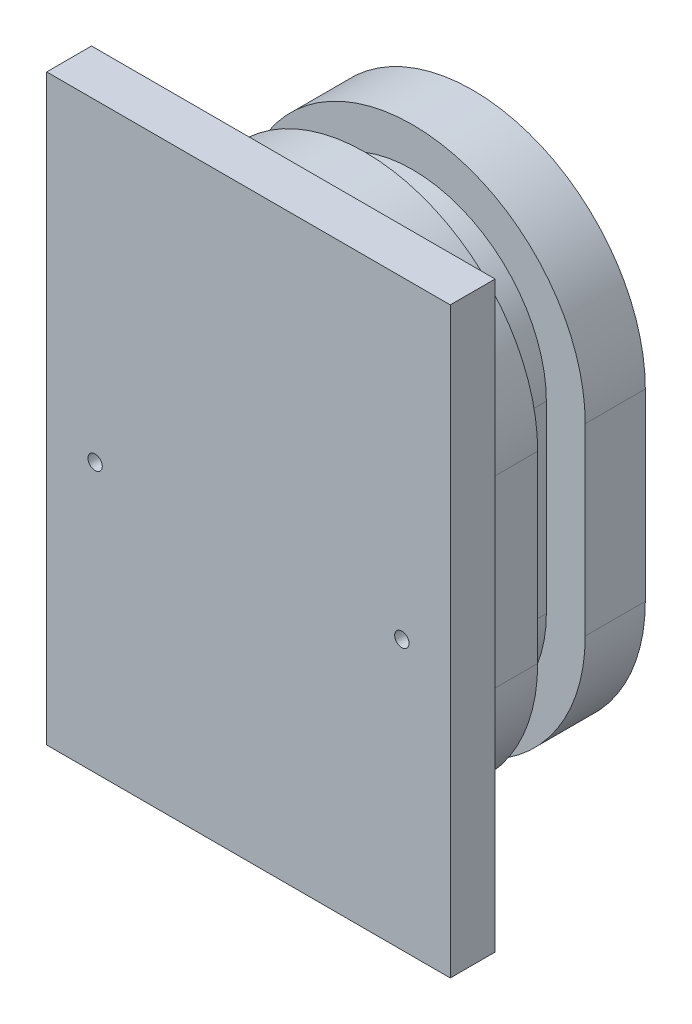
ISO-10303-21;
HEADER;
FILE_DESCRIPTION(('STEP AP214'),'2;1');
FILE_NAME('part.step','',(''),(''),'','','');
FILE_SCHEMA(('AUTOMOTIVE_DESIGN { 1 0 10303 214 1 1 1 1 }'));
ENDSEC;
DATA;
#1=APPLICATION_CONTEXT('core data for automotive mechanical design processes');
#2=APPLICATION_PROTOCOL_DEFINITION('international standard','automotive_design',2000,#1);
#3=PRODUCT_CONTEXT('',#1,'mechanical');
#4=PRODUCT('Part','Part','',(#3));
#5=PRODUCT_RELATED_PRODUCT_CATEGORY('part','',(#4));
#6=PRODUCT_DEFINITION_FORMATION('','',#4);
#7=PRODUCT_DEFINITION_CONTEXT('part definition',#1,'design');
#8=PRODUCT_DEFINITION('design','',#6,#7);
#9=PRODUCT_DEFINITION_SHAPE('','',#8);
#10=(LENGTH_UNIT() NAMED_UNIT(*) SI_UNIT(.MILLI.,.METRE.));
#11=(NAMED_UNIT(*) PLANE_ANGLE_UNIT() SI_UNIT($,.RADIAN.));
#12=(NAMED_UNIT(*) SI_UNIT($,.STERADIAN.) SOLID_ANGLE_UNIT());
#13=UNCERTAINTY_MEASURE_WITH_UNIT(LENGTH_MEASURE(1.E-05),#10,'distance_accuracy_value','');
#14=(GEOMETRIC_REPRESENTATION_CONTEXT(3) GLOBAL_UNCERTAINTY_ASSIGNED_CONTEXT((#13)) GLOBAL_UNIT_ASSIGNED_CONTEXT((#10,
#11,#12)) REPRESENTATION_CONTEXT('',''));
#15=CARTESIAN_POINT('',(0.,0.,0.));
#16=DIRECTION('',(0.,0.,1.));
#17=DIRECTION('',(1.,0.,0.));
#18=AXIS2_PLACEMENT_3D('',#15,#16,#17);
#19=CARTESIAN_POINT('',(2.88620795061788,-6.03673923854262,-20.));
#20=DIRECTION('',(0.,0.,-1.));
#21=DIRECTION('',(-1.,0.,0.));
#22=AXIS2_PLACEMENT_3D('',#19,#20,#21);
#23=PLANE('',#22);
#24=CARTESIAN_POINT('',(2.88620795061788,-6.03673923854262,-20.));
#25=DIRECTION('',(0.,0.,-1.));
#26=DIRECTION('',(-1.,0.,0.));
#27=AXIS2_PLACEMENT_3D('',#24,#25,#26);
#28=CIRCLE('',#27,19.25);
#29=CARTESIAN_POINT('',(-16.3637920493821,-6.03673923854262,-20.));
#30=VERTEX_POINT('',#29);
#31=CARTESIAN_POINT('',(22.1362079506179,-6.03673923854262,-20.));
#32=VERTEX_POINT('',#31);
#33=EDGE_CURVE('E321',#30,#32,#28,.T.);
#34=ORIENTED_EDGE('',*,*,#33,.T.);
#35=DIRECTION('',(0.,-1.,0.));
#36=VECTOR('',#35,1.);
#37=CARTESIAN_POINT('',(22.1362079506179,-6.03673923854262,-20.));
#38=LINE('',#37,#36);
#39=CARTESIAN_POINT('',(22.1362079506179,-26.5367392385426,-20.));
#40=VERTEX_POINT('',#39);
#41=EDGE_CURVE('E325',#32,#40,#38,.T.);
#42=ORIENTED_EDGE('',*,*,#41,.T.);
#43=CARTESIAN_POINT('',(2.88620795061788,-26.5367392385426,-20.));
#44=DIRECTION('',(0.,0.,-1.));
#45=DIRECTION('',(-1.,0.,0.));
#46=AXIS2_PLACEMENT_3D('',#43,#44,#45);
#47=CIRCLE('',#46,19.25);
#48=CARTESIAN_POINT('',(-16.3637920493821,-26.5367392385426,-20.));
#49=VERTEX_POINT('',#48);
#50=EDGE_CURVE('E329',#40,#49,#47,.T.);
#51=ORIENTED_EDGE('',*,*,#50,.T.);
#52=DIRECTION('',(0.,1.,0.));
#53=VECTOR('',#52,1.);
#54=CARTESIAN_POINT('',(-16.3637920493821,-6.03673923854262,-20.));
#55=LINE('',#54,#53);
#56=EDGE_CURVE('E332',#49,#30,#55,.T.);
#57=ORIENTED_EDGE('',*,*,#56,.T.);
#58=EDGE_LOOP('',(#34,#42,#51,#57));
#59=FACE_BOUND('',#58,.T.);
#60=DIRECTION('',(0.,-1.,0.));
#61=VECTOR('',#60,1.);
#62=CARTESIAN_POINT('',(13.6362079506179,-6.03673923854262,-20.));
#63=LINE('',#62,#61);
#64=CARTESIAN_POINT('',(13.6362079506179,-6.03673923854262,-20.));
#65=VERTEX_POINT('',#64);
#66=CARTESIAN_POINT('',(13.6362079506179,-26.5367392385426,-20.));
#67=VERTEX_POINT('',#66);
#68=EDGE_CURVE('E282',#65,#67,#63,.T.);
#69=ORIENTED_EDGE('',*,*,#68,.F.);
#70=CARTESIAN_POINT('',(2.88620795061788,-6.03673923854262,-20.));
#71=DIRECTION('',(0.,0.,-1.));
#72=DIRECTION('',(-1.,0.,0.));
#73=AXIS2_PLACEMENT_3D('',#70,#71,#72);
#74=CIRCLE('',#73,10.75);
#75=CARTESIAN_POINT('',(-7.86379204938211,-6.03673923854262,-20.));
#76=VERTEX_POINT('',#75);
#77=EDGE_CURVE('E279',#76,#65,#74,.T.);
#78=ORIENTED_EDGE('',*,*,#77,.F.);
#79=DIRECTION('',(0.,1.,0.));
#80=VECTOR('',#79,1.);
#81=CARTESIAN_POINT('',(-7.86379204938211,-6.03673923854262,-20.));
#82=LINE('',#81,#80);
#83=CARTESIAN_POINT('',(-7.86379204938211,-26.5367392385426,-20.));
#84=VERTEX_POINT('',#83);
#85=EDGE_CURVE('E290',#84,#76,#82,.T.);
#86=ORIENTED_EDGE('',*,*,#85,.F.);
#87=CARTESIAN_POINT('',(2.88620795061788,-26.5367392385426,-20.));
#88=DIRECTION('',(0.,0.,-1.));
#89=DIRECTION('',(-1.,0.,0.));
#90=AXIS2_PLACEMENT_3D('',#87,#88,#89);
#91=CIRCLE('',#90,10.75);
#92=EDGE_CURVE('E286',#67,#84,#91,.T.);
#93=ORIENTED_EDGE('',*,*,#92,.F.);
#94=EDGE_LOOP('',(#69,#78,#86,#93));
#95=FACE_BOUND('',#94,.T.);
#96=ADVANCED_FACE('F44',(#59,#95),#23,.T.);
#97=CARTESIAN_POINT('',(2.88620795061788,-6.03673923854262,-20.));
#98=DIRECTION('',(0.,0.,1.));
#99=DIRECTION('',(1.,0.,0.));
#100=AXIS2_PLACEMENT_3D('',#97,#98,#99);
#101=CYLINDRICAL_SURFACE('',#100,19.25);
#102=DIRECTION('',(0.,0.,1.));
#103=VECTOR('',#102,1.);
#104=CARTESIAN_POINT('',(-16.3637920493821,-6.03673923854262,-20.));
#105=LINE('',#104,#103);
#106=CARTESIAN_POINT('',(-16.3637920493821,-6.03673923854262,-13.3));
#107=VERTEX_POINT('',#106);
#108=EDGE_CURVE('E350',#30,#107,#105,.T.);
#109=ORIENTED_EDGE('',*,*,#108,.T.);
#110=CARTESIAN_POINT('',(2.88620795061788,-6.03673923854262,-13.3));
#111=DIRECTION('',(0.,0.,-1.));
#112=DIRECTION('',(-1.,0.,0.));
#113=AXIS2_PLACEMENT_3D('',#110,#111,#112);
#114=CIRCLE('',#113,19.25);
#115=CARTESIAN_POINT('',(22.1362079506179,-6.03673923854262,-13.3));
#116=VERTEX_POINT('',#115);
#117=EDGE_CURVE('E68',#107,#116,#114,.T.);
#118=ORIENTED_EDGE('',*,*,#117,.T.);
#119=DIRECTION('',(0.,0.,1.));
#120=VECTOR('',#119,1.);
#121=CARTESIAN_POINT('',(22.1362079506179,-6.03673923854262,-20.));
#122=LINE('',#121,#120);
#123=EDGE_CURVE('E365',#32,#116,#122,.T.);
#124=ORIENTED_EDGE('',*,*,#123,.F.);
#125=ORIENTED_EDGE('',*,*,#33,.F.);
#126=EDGE_LOOP('',(#109,#118,#124,#125));
#127=FACE_BOUND('',#126,.T.);
#128=ADVANCED_FACE('F436',(#127),#101,.T.);
#129=CARTESIAN_POINT('',(22.1362079506179,-6.03673923854262,-20.));
#130=DIRECTION('',(-1.,0.,0.));
#131=DIRECTION('',(0.,0.,1.));
#132=AXIS2_PLACEMENT_3D('',#129,#130,#131);
#133=PLANE('',#132);
#134=ORIENTED_EDGE('',*,*,#123,.T.);
#135=DIRECTION('',(0.,-1.,0.));
#136=VECTOR('',#135,1.);
#137=CARTESIAN_POINT('',(22.1362079506179,-6.03673923854262,-13.3));
#138=LINE('',#137,#136);
#139=CARTESIAN_POINT('',(22.1362079506179,-26.5367392385426,-13.3));
#140=VERTEX_POINT('',#139);
#141=EDGE_CURVE('E257',#116,#140,#138,.T.);
#142=ORIENTED_EDGE('',*,*,#141,.T.);
#143=DIRECTION('',(0.,0.,1.));
#144=VECTOR('',#143,1.);
#145=CARTESIAN_POINT('',(22.1362079506179,-26.5367392385426,-20.));
#146=LINE('',#145,#144);
#147=EDGE_CURVE('E360',#40,#140,#146,.T.);
#148=ORIENTED_EDGE('',*,*,#147,.F.);
#149=ORIENTED_EDGE('',*,*,#41,.F.);
#150=EDGE_LOOP('',(#134,#142,#148,#149));
#151=FACE_BOUND('',#150,.T.);
#152=ADVANCED_FACE('F442',(#151),#133,.F.);
#153=CARTESIAN_POINT('',(2.88620795061788,-26.5367392385426,-20.));
#154=DIRECTION('',(0.,0.,1.));
#155=DIRECTION('',(1.,0.,0.));
#156=AXIS2_PLACEMENT_3D('',#153,#154,#155);
#157=CYLINDRICAL_SURFACE('',#156,19.25);
#158=ORIENTED_EDGE('',*,*,#147,.T.);
#159=CARTESIAN_POINT('',(2.88620795061788,-26.5367392385426,-13.3));
#160=DIRECTION('',(0.,0.,-1.));
#161=DIRECTION('',(-1.,0.,0.));
#162=AXIS2_PLACEMENT_3D('',#159,#160,#161);
#163=CIRCLE('',#162,19.25);
#164=CARTESIAN_POINT('',(-16.3637920493821,-26.5367392385426,-13.3));
#165=VERTEX_POINT('',#164);
#166=EDGE_CURVE('E262',#140,#165,#163,.T.);
#167=ORIENTED_EDGE('',*,*,#166,.T.);
#168=DIRECTION('',(0.,0.,1.));
#169=VECTOR('',#168,1.);
#170=CARTESIAN_POINT('',(-16.3637920493821,-26.5367392385426,-20.));
#171=LINE('',#170,#169);
#172=EDGE_CURVE('E355',#49,#165,#171,.T.);
#173=ORIENTED_EDGE('',*,*,#172,.F.);
#174=ORIENTED_EDGE('',*,*,#50,.F.);
#175=EDGE_LOOP('',(#158,#167,#173,#174));
#176=FACE_BOUND('',#175,.T.);
#177=ADVANCED_FACE('F454',(#176),#157,.T.);
#178=CARTESIAN_POINT('',(-16.3637920493821,-6.03673923854262,-20.));
#179=DIRECTION('',(1.,0.,0.));
#180=DIRECTION('',(0.,0.,-1.));
#181=AXIS2_PLACEMENT_3D('',#178,#179,#180);
#182=PLANE('',#181);
#183=ORIENTED_EDGE('',*,*,#172,.T.);
#184=DIRECTION('',(0.,1.,0.));
#185=VECTOR('',#184,1.);
#186=CARTESIAN_POINT('',(-16.3637920493821,-6.03673923854262,-13.3));
#187=LINE('',#186,#185);
#188=EDGE_CURVE('E266',#165,#107,#187,.T.);
#189=ORIENTED_EDGE('',*,*,#188,.T.);
#190=ORIENTED_EDGE('',*,*,#108,.F.);
#191=ORIENTED_EDGE('',*,*,#56,.F.);
#192=EDGE_LOOP('',(#183,#189,#190,#191));
#193=FACE_BOUND('',#192,.T.);
#194=ADVANCED_FACE('F451',(#193),#182,.F.);
#195=CARTESIAN_POINT('',(2.88620795061788,-6.03673923854262,-20.));
#196=DIRECTION('',(0.,0.,1.));
#197=DIRECTION('',(1.,0.,0.));
#198=AXIS2_PLACEMENT_3D('',#195,#196,#197);
#199=CYLINDRICAL_SURFACE('',#198,10.75);
#200=CARTESIAN_POINT('',(2.88620795061788,-6.03673923854262,0.));
#201=DIRECTION('',(0.,0.,-1.));
#202=DIRECTION('',(-1.,0.,0.));
#203=AXIS2_PLACEMENT_3D('',#200,#201,#202);
#204=CIRCLE('',#203,10.75);
#205=CARTESIAN_POINT('',(-7.86379204938211,-6.03673923854262,0.));
#206=VERTEX_POINT('',#205);
#207=CARTESIAN_POINT('',(13.6362079506179,-6.03673923854262,0.));
#208=VERTEX_POINT('',#207);
#209=EDGE_CURVE('E269',#206,#208,#204,.T.);
#210=ORIENTED_EDGE('',*,*,#209,.F.);
#211=DIRECTION('',(0.,0.,1.));
#212=VECTOR('',#211,1.);
#213=CARTESIAN_POINT('',(-7.86379204938211,-6.03673923854262,-20.));
#214=LINE('',#213,#212);
#215=EDGE_CURVE('E293',#76,#206,#214,.T.);
#216=ORIENTED_EDGE('',*,*,#215,.F.);
#217=ORIENTED_EDGE('',*,*,#77,.T.);
#218=DIRECTION('',(0.,0.,1.));
#219=VECTOR('',#218,1.);
#220=CARTESIAN_POINT('',(13.6362079506179,-6.03673923854262,-20.));
#221=LINE('',#220,#219);
#222=EDGE_CURVE('E316',#65,#208,#221,.T.);
#223=ORIENTED_EDGE('',*,*,#222,.T.);
#224=EDGE_LOOP('',(#210,#216,#217,#223));
#225=FACE_BOUND('',#224,.T.);
#226=ADVANCED_FACE('F449',(#225),#199,.F.);
#227=CARTESIAN_POINT('',(13.6362079506179,-6.03673923854262,-20.));
#228=DIRECTION('',(-1.,0.,0.));
#229=DIRECTION('',(0.,-1.,0.));
#230=AXIS2_PLACEMENT_3D('',#227,#228,#229);
#231=PLANE('',#230);
#232=DIRECTION('',(0.,-1.,0.));
#233=VECTOR('',#232,1.);
#234=CARTESIAN_POINT('',(13.6362079506179,-6.03673923854262,0.));
#235=LINE('',#234,#233);
#236=CARTESIAN_POINT('',(13.6362079506179,-26.5367392385426,0.));
#237=VERTEX_POINT('',#236);
#238=EDGE_CURVE('E297',#208,#237,#235,.T.);
#239=ORIENTED_EDGE('',*,*,#238,.F.);
#240=ORIENTED_EDGE('',*,*,#222,.F.);
#241=ORIENTED_EDGE('',*,*,#68,.T.);
#242=DIRECTION('',(0.,0.,1.));
#243=VECTOR('',#242,1.);
#244=CARTESIAN_POINT('',(13.6362079506179,-26.5367392385426,-20.));
#245=LINE('',#244,#243);
#246=EDGE_CURVE('E313',#67,#237,#245,.T.);
#247=ORIENTED_EDGE('',*,*,#246,.T.);
#248=EDGE_LOOP('',(#239,#240,#241,#247));
#249=FACE_BOUND('',#248,.T.);
#250=ADVANCED_FACE('F540',(#249),#231,.T.);
#251=CARTESIAN_POINT('',(2.88620795061788,-26.5367392385426,-20.));
#252=DIRECTION('',(0.,0.,1.));
#253=DIRECTION('',(1.,0.,0.));
#254=AXIS2_PLACEMENT_3D('',#251,#252,#253);
#255=CYLINDRICAL_SURFACE('',#254,10.75);
#256=CARTESIAN_POINT('',(2.88620795061788,-26.5367392385426,0.));
#257=DIRECTION('',(0.,0.,-1.));
#258=DIRECTION('',(-1.,0.,0.));
#259=AXIS2_PLACEMENT_3D('',#256,#257,#258);
#260=CIRCLE('',#259,10.75);
#261=CARTESIAN_POINT('',(-7.86379204938211,-26.5367392385426,0.));
#262=VERTEX_POINT('',#261);
#263=EDGE_CURVE('E301',#237,#262,#260,.T.);
#264=ORIENTED_EDGE('',*,*,#263,.F.);
#265=ORIENTED_EDGE('',*,*,#246,.F.);
#266=ORIENTED_EDGE('',*,*,#92,.T.);
#267=DIRECTION('',(0.,0.,1.));
#268=VECTOR('',#267,1.);
#269=CARTESIAN_POINT('',(-7.86379204938211,-26.5367392385426,-20.));
#270=LINE('',#269,#268);
#271=EDGE_CURVE('E310',#84,#262,#270,.T.);
#272=ORIENTED_EDGE('',*,*,#271,.T.);
#273=EDGE_LOOP('',(#264,#265,#266,#272));
#274=FACE_BOUND('',#273,.T.);
#275=ADVANCED_FACE('F537',(#274),#255,.F.);
#276=CARTESIAN_POINT('',(-7.86379204938211,-6.03673923854262,-20.));
#277=DIRECTION('',(1.,0.,0.));
#278=DIRECTION('',(0.,1.,0.));
#279=AXIS2_PLACEMENT_3D('',#276,#277,#278);
#280=PLANE('',#279);
#281=DIRECTION('',(0.,1.,0.));
#282=VECTOR('',#281,1.);
#283=CARTESIAN_POINT('',(-7.86379204938211,-6.03673923854262,0.));
#284=LINE('',#283,#282);
#285=EDGE_CURVE('E283',#262,#206,#284,.T.);
#286=ORIENTED_EDGE('',*,*,#285,.F.);
#287=ORIENTED_EDGE('',*,*,#271,.F.);
#288=ORIENTED_EDGE('',*,*,#85,.T.);
#289=ORIENTED_EDGE('',*,*,#215,.T.);
#290=EDGE_LOOP('',(#286,#287,#288,#289));
#291=FACE_BOUND('',#290,.T.);
#292=ADVANCED_FACE('F469',(#291),#280,.T.);
#293=CARTESIAN_POINT('',(0.,0.,0.));
#294=DIRECTION('',(0.,0.,1.));
#295=DIRECTION('',(1.,0.,0.));
#296=AXIS2_PLACEMENT_3D('',#293,#294,#295);
#297=PLANE('',#296);
#298=ORIENTED_EDGE('',*,*,#285,.T.);
#299=ORIENTED_EDGE('',*,*,#209,.T.);
#300=ORIENTED_EDGE('',*,*,#238,.T.);
#301=ORIENTED_EDGE('',*,*,#263,.T.);
#302=EDGE_LOOP('',(#298,#299,#300,#301));
#303=FACE_BOUND('',#302,.T.);
#304=ADVANCED_FACE('F465',(#303),#297,.F.);
#305=CARTESIAN_POINT('',(2.88620795061788,-6.03673923854262,-13.3));
#306=DIRECTION('',(0.,0.,-1.));
#307=DIRECTION('',(-1.,0.,0.));
#308=AXIS2_PLACEMENT_3D('',#305,#306,#307);
#309=PLANE('',#308);
#310=ORIENTED_EDGE('',*,*,#117,.F.);
#311=ORIENTED_EDGE('',*,*,#188,.F.);
#312=ORIENTED_EDGE('',*,*,#166,.F.);
#313=ORIENTED_EDGE('',*,*,#141,.F.);
#314=EDGE_LOOP('',(#310,#311,#312,#313));
#315=FACE_BOUND('',#314,.T.);
#316=DIRECTION('',(0.,-1.,0.));
#317=VECTOR('',#316,1.);
#318=CARTESIAN_POINT('',(17.8022079506179,-6.03673923854262,-13.3));
#319=LINE('',#318,#317);
#320=CARTESIAN_POINT('',(17.8022079506179,-6.03673923854262,-13.3));
#321=VERTEX_POINT('',#320);
#322=CARTESIAN_POINT('',(17.8022079506179,-26.5367392385426,-13.3));
#323=VERTEX_POINT('',#322);
#324=EDGE_CURVE('E215',#321,#323,#319,.T.);
#325=ORIENTED_EDGE('',*,*,#324,.T.);
#326=CARTESIAN_POINT('',(2.88620795061788,-26.5367392385426,-13.3));
#327=DIRECTION('',(0.,0.,-1.));
#328=DIRECTION('',(-1.,0.,0.));
#329=AXIS2_PLACEMENT_3D('',#326,#327,#328);
#330=CIRCLE('',#329,14.916);
#331=CARTESIAN_POINT('',(-12.0297920493821,-26.5367392385426,-13.3));
#332=VERTEX_POINT('',#331);
#333=EDGE_CURVE('E219',#323,#332,#330,.T.);
#334=ORIENTED_EDGE('',*,*,#333,.T.);
#335=DIRECTION('',(0.,1.,0.));
#336=VECTOR('',#335,1.);
#337=CARTESIAN_POINT('',(-12.0297920493821,-6.03673923854262,-13.3));
#338=LINE('',#337,#336);
#339=CARTESIAN_POINT('',(-12.0297920493821,-6.03673923854262,-13.3));
#340=VERTEX_POINT('',#339);
#341=EDGE_CURVE('E223',#332,#340,#338,.T.);
#342=ORIENTED_EDGE('',*,*,#341,.T.);
#343=CARTESIAN_POINT('',(2.88620795061788,-6.03673923854262,-13.3));
#344=DIRECTION('',(0.,0.,-1.));
#345=DIRECTION('',(-1.,0.,0.));
#346=AXIS2_PLACEMENT_3D('',#343,#344,#345);
#347=CIRCLE('',#346,14.916);
#348=EDGE_CURVE('E212',#340,#321,#347,.T.);
#349=ORIENTED_EDGE('',*,*,#348,.T.);
#350=EDGE_LOOP('',(#325,#334,#342,#349));
#351=FACE_BOUND('',#350,.T.);
#352=ADVANCED_FACE('F468',(#315,#351),#309,.F.);
#353=CARTESIAN_POINT('',(2.88620795061788,-6.03673923854262,-8.));
#354=DIRECTION('',(0.,0.,-1.));
#355=DIRECTION('',(-1.,0.,0.));
#356=AXIS2_PLACEMENT_3D('',#353,#354,#355);
#357=PLANE('',#356);
#358=CARTESIAN_POINT('',(2.88620795061788,-6.03673923854262,-8.));
#359=DIRECTION('',(0.,0.,-1.));
#360=DIRECTION('',(-1.,0.,0.));
#361=AXIS2_PLACEMENT_3D('',#358,#359,#360);
#362=CIRCLE('',#361,19.25);
#363=CARTESIAN_POINT('',(-16.3637920493821,-6.03673923854262,-8.));
#364=VERTEX_POINT('',#363);
#365=CARTESIAN_POINT('',(22.1362079506179,-6.03673923854262,-8.));
#366=VERTEX_POINT('',#365);
#367=EDGE_CURVE('E254',#364,#366,#362,.T.);
#368=ORIENTED_EDGE('',*,*,#367,.T.);
#369=DIRECTION('',(0.,-1.,0.));
#370=VECTOR('',#369,1.);
#371=CARTESIAN_POINT('',(22.1362079506179,-6.03673923854262,-8.));
#372=LINE('',#371,#370);
#373=CARTESIAN_POINT('',(22.1362079506179,-26.5367392385426,-8.));
#374=VERTEX_POINT('',#373);
#375=EDGE_CURVE('E272',#366,#374,#372,.T.);
#376=ORIENTED_EDGE('',*,*,#375,.T.);
#377=CARTESIAN_POINT('',(2.88620795061788,-26.5367392385426,-8.));
#378=DIRECTION('',(0.,0.,-1.));
#379=DIRECTION('',(-1.,0.,0.));
#380=AXIS2_PLACEMENT_3D('',#377,#378,#379);
#381=CIRCLE('',#380,19.25);
#382=CARTESIAN_POINT('',(-16.3637920493821,-26.5367392385426,-8.));
#383=VERTEX_POINT('',#382);
#384=EDGE_CURVE('E60',#374,#383,#381,.T.);
#385=ORIENTED_EDGE('',*,*,#384,.T.);
#386=DIRECTION('',(0.,1.,0.));
#387=VECTOR('',#386,1.);
#388=CARTESIAN_POINT('',(-16.3637920493821,-6.03673923854262,-8.));
#389=LINE('',#388,#387);
#390=EDGE_CURVE('E258',#383,#364,#389,.T.);
#391=ORIENTED_EDGE('',*,*,#390,.T.);
#392=EDGE_LOOP('',(#368,#376,#385,#391));
#393=FACE_BOUND('',#392,.T.);
#394=CARTESIAN_POINT('',(2.88620795061788,-6.03673923854262,-8.));
#395=DIRECTION('',(0.,0.,-1.));
#396=DIRECTION('',(-1.,0.,0.));
#397=AXIS2_PLACEMENT_3D('',#394,#395,#396);
#398=CIRCLE('',#397,14.916);
#399=CARTESIAN_POINT('',(-12.0297920493821,-6.03673923854262,-8.));
#400=VERTEX_POINT('',#399);
#401=CARTESIAN_POINT('',(17.8022079506179,-6.03673923854262,-8.));
#402=VERTEX_POINT('',#401);
#403=EDGE_CURVE('E211',#400,#402,#398,.T.);
#404=ORIENTED_EDGE('',*,*,#403,.F.);
#405=DIRECTION('',(0.,1.,0.));
#406=VECTOR('',#405,1.);
#407=CARTESIAN_POINT('',(-12.0297920493821,-6.03673923854262,-8.));
#408=LINE('',#407,#406);
#409=CARTESIAN_POINT('',(-12.0297920493821,-26.5367392385426,-8.));
#410=VERTEX_POINT('',#409);
#411=EDGE_CURVE('E216',#410,#400,#408,.T.);
#412=ORIENTED_EDGE('',*,*,#411,.F.);
#413=CARTESIAN_POINT('',(2.88620795061788,-26.5367392385426,-8.));
#414=DIRECTION('',(0.,0.,-1.));
#415=DIRECTION('',(-1.,0.,0.));
#416=AXIS2_PLACEMENT_3D('',#413,#414,#415);
#417=CIRCLE('',#416,14.916);
#418=CARTESIAN_POINT('',(17.8022079506179,-26.5367392385426,-8.));
#419=VERTEX_POINT('',#418);
#420=EDGE_CURVE('E234',#419,#410,#417,.T.);
#421=ORIENTED_EDGE('',*,*,#420,.F.);
#422=DIRECTION('',(0.,-1.,0.));
#423=VECTOR('',#422,1.);
#424=CARTESIAN_POINT('',(17.8022079506179,-6.03673923854262,-8.));
#425=LINE('',#424,#423);
#426=EDGE_CURVE('E230',#402,#419,#425,.T.);
#427=ORIENTED_EDGE('',*,*,#426,.F.);
#428=EDGE_LOOP('',(#404,#412,#421,#427));
#429=FACE_BOUND('',#428,.T.);
#430=ADVANCED_FACE('F502',(#393,#429),#357,.T.);
#431=CARTESIAN_POINT('',(2.88620795061788,-6.03673923854262,-13.3));
#432=DIRECTION('',(0.,0.,1.));
#433=DIRECTION('',(1.,0.,0.));
#434=AXIS2_PLACEMENT_3D('',#431,#432,#433);
#435=CYLINDRICAL_SURFACE('',#434,14.916);
#436=ORIENTED_EDGE('',*,*,#403,.T.);
#437=DIRECTION('',(0.,0.,1.));
#438=VECTOR('',#437,1.);
#439=CARTESIAN_POINT('',(17.8022079506179,-6.03673923854262,-13.3));
#440=LINE('',#439,#438);
#441=EDGE_CURVE('E250',#321,#402,#440,.T.);
#442=ORIENTED_EDGE('',*,*,#441,.F.);
#443=ORIENTED_EDGE('',*,*,#348,.F.);
#444=DIRECTION('',(0.,0.,1.));
#445=VECTOR('',#444,1.);
#446=CARTESIAN_POINT('',(-12.0297920493821,-6.03673923854262,-13.3));
#447=LINE('',#446,#445);
#448=EDGE_CURVE('E226',#340,#400,#447,.T.);
#449=ORIENTED_EDGE('',*,*,#448,.T.);
#450=EDGE_LOOP('',(#436,#442,#443,#449));
#451=FACE_BOUND('',#450,.T.);
#452=ADVANCED_FACE('F505',(#451),#435,.T.);
#453=CARTESIAN_POINT('',(17.8022079506179,-6.03673923854262,-13.3));
#454=DIRECTION('',(-1.,0.,0.));
#455=DIRECTION('',(0.,0.,1.));
#456=AXIS2_PLACEMENT_3D('',#453,#454,#455);
#457=PLANE('',#456);
#458=ORIENTED_EDGE('',*,*,#426,.T.);
#459=DIRECTION('',(0.,0.,1.));
#460=VECTOR('',#459,1.);
#461=CARTESIAN_POINT('',(17.8022079506179,-26.5367392385426,-13.3));
#462=LINE('',#461,#460);
#463=EDGE_CURVE('E247',#323,#419,#462,.T.);
#464=ORIENTED_EDGE('',*,*,#463,.F.);
#465=ORIENTED_EDGE('',*,*,#324,.F.);
#466=ORIENTED_EDGE('',*,*,#441,.T.);
#467=EDGE_LOOP('',(#458,#464,#465,#466));
#468=FACE_BOUND('',#467,.T.);
#469=ADVANCED_FACE('F522',(#468),#457,.F.);
#470=CARTESIAN_POINT('',(2.88620795061788,-26.5367392385426,-13.3));
#471=DIRECTION('',(0.,0.,1.));
#472=DIRECTION('',(1.,0.,0.));
#473=AXIS2_PLACEMENT_3D('',#470,#471,#472);
#474=CYLINDRICAL_SURFACE('',#473,14.916);
#475=ORIENTED_EDGE('',*,*,#420,.T.);
#476=DIRECTION('',(0.,0.,1.));
#477=VECTOR('',#476,1.);
#478=CARTESIAN_POINT('',(-12.0297920493821,-26.5367392385426,-13.3));
#479=LINE('',#478,#477);
#480=EDGE_CURVE('E244',#332,#410,#479,.T.);
#481=ORIENTED_EDGE('',*,*,#480,.F.);
#482=ORIENTED_EDGE('',*,*,#333,.F.);
#483=ORIENTED_EDGE('',*,*,#463,.T.);
#484=EDGE_LOOP('',(#475,#481,#482,#483));
#485=FACE_BOUND('',#484,.T.);
#486=ADVANCED_FACE('F517',(#485),#474,.T.);
#487=CARTESIAN_POINT('',(-12.0297920493821,-6.03673923854262,-13.3));
#488=DIRECTION('',(1.,0.,0.));
#489=DIRECTION('',(0.,1.,0.));
#490=AXIS2_PLACEMENT_3D('',#487,#488,#489);
#491=PLANE('',#490);
#492=ORIENTED_EDGE('',*,*,#411,.T.);
#493=ORIENTED_EDGE('',*,*,#448,.F.);
#494=ORIENTED_EDGE('',*,*,#341,.F.);
#495=ORIENTED_EDGE('',*,*,#480,.T.);
#496=EDGE_LOOP('',(#492,#493,#494,#495));
#497=FACE_BOUND('',#496,.T.);
#498=ADVANCED_FACE('F432',(#497),#491,.F.);
#499=CARTESIAN_POINT('',(0.,0.,5.));
#500=DIRECTION('',(0.,0.,1.));
#501=DIRECTION('',(1.,0.,0.));
#502=AXIS2_PLACEMENT_3D('',#499,#500,#501);
#503=PLANE('',#502);
#504=CARTESIAN_POINT('',(-14.2137920493821,-18.7867392385426,5.));
#505=DIRECTION('',(0.,0.,1.));
#506=DIRECTION('',(1.,0.,0.));
#507=AXIS2_PLACEMENT_3D('',#504,#505,#506);
#508=CIRCLE('',#507,0.79999999999999);
#509=CARTESIAN_POINT('',(-13.4137920493821,-18.7867392385426,5.));
#510=VERTEX_POINT('',#509);
#511=EDGE_CURVE('E198',#510,#510,#508,.T.);
#512=ORIENTED_EDGE('',*,*,#511,.F.);
#513=EDGE_LOOP('',(#512));
#514=FACE_BOUND('',#513,.T.);
#515=CARTESIAN_POINT('',(19.9862079506179,-18.7867392385426,5.));
#516=DIRECTION('',(0.,0.,1.));
#517=DIRECTION('',(1.,0.,0.));
#518=AXIS2_PLACEMENT_3D('',#515,#516,#517);
#519=CIRCLE('',#518,0.799999999999988);
#520=CARTESIAN_POINT('',(20.7862079506179,-18.7867392385426,5.));
#521=VERTEX_POINT('',#520);
#522=EDGE_CURVE('E197',#521,#521,#519,.T.);
#523=ORIENTED_EDGE('',*,*,#522,.F.);
#524=EDGE_LOOP('',(#523));
#525=FACE_BOUND('',#524,.T.);
#526=DIRECTION('',(0.,-1.,0.));
#527=VECTOR('',#526,1.);
#528=CARTESIAN_POINT('',(-19.6137920493821,16.2132607614574,5.));
#529=LINE('',#528,#527);
#530=CARTESIAN_POINT('',(-19.6137920493821,16.2132607614574,5.));
#531=VERTEX_POINT('',#530);
#532=CARTESIAN_POINT('',(-19.6137920493821,-48.7867392385426,5.));
#533=VERTEX_POINT('',#532);
#534=EDGE_CURVE('E370',#531,#533,#529,.T.);
#535=ORIENTED_EDGE('',*,*,#534,.T.);
#536=DIRECTION('',(1.,0.,0.));
#537=VECTOR('',#536,1.);
#538=CARTESIAN_POINT('',(-19.6137920493821,-48.7867392385426,5.));
#539=LINE('',#538,#537);
#540=CARTESIAN_POINT('',(25.3862079506179,-48.7867392385426,5.));
#541=VERTEX_POINT('',#540);
#542=EDGE_CURVE('E374',#533,#541,#539,.T.);
#543=ORIENTED_EDGE('',*,*,#542,.T.);
#544=DIRECTION('',(0.,1.,0.));
#545=VECTOR('',#544,1.);
#546=CARTESIAN_POINT('',(25.3862079506179,16.2132607614574,5.));
#547=LINE('',#546,#545);
#548=CARTESIAN_POINT('',(25.3862079506179,16.2132607614574,5.));
#549=VERTEX_POINT('',#548);
#550=EDGE_CURVE('E378',#541,#549,#547,.T.);
#551=ORIENTED_EDGE('',*,*,#550,.T.);
#552=DIRECTION('',(-1.,0.,0.));
#553=VECTOR('',#552,1.);
#554=CARTESIAN_POINT('',(-19.6137920493821,16.2132607614574,5.));
#555=LINE('',#554,#553);
#556=EDGE_CURVE('E381',#549,#531,#555,.T.);
#557=ORIENTED_EDGE('',*,*,#556,.T.);
#558=EDGE_LOOP('',(#535,#543,#551,#557));
#559=FACE_BOUND('',#558,.T.);
#560=ADVANCED_FACE('F424',(#514,#525,#559),#503,.T.);
#561=CARTESIAN_POINT('',(-19.6137920493821,-48.7867392385426,5.));
#562=DIRECTION('',(0.,1.,0.));
#563=DIRECTION('',(0.,0.,1.));
#564=AXIS2_PLACEMENT_3D('',#561,#562,#563);
#565=PLANE('',#564);
#566=DIRECTION('',(1.,0.,0.));
#567=VECTOR('',#566,1.);
#568=CARTESIAN_POINT('',(-19.6137920493821,-48.7867392385426,0.));
#569=LINE('',#568,#567);
#570=CARTESIAN_POINT('',(-19.6137920493821,-48.7867392385426,0.));
#571=VERTEX_POINT('',#570);
#572=CARTESIAN_POINT('',(25.3862079506179,-48.7867392385426,0.));
#573=VERTEX_POINT('',#572);
#574=EDGE_CURVE('E388',#571,#573,#569,.T.);
#575=ORIENTED_EDGE('',*,*,#574,.T.);
#576=DIRECTION('',(0.,0.,-1.));
#577=VECTOR('',#576,1.);
#578=CARTESIAN_POINT('',(25.3862079506179,-48.7867392385426,5.));
#579=LINE('',#578,#577);
#580=EDGE_CURVE('E53',#541,#573,#579,.T.);
#581=ORIENTED_EDGE('',*,*,#580,.F.);
#582=ORIENTED_EDGE('',*,*,#542,.F.);
#583=DIRECTION('',(0.,0.,-1.));
#584=VECTOR('',#583,1.);
#585=CARTESIAN_POINT('',(-19.6137920493821,-48.7867392385426,5.));
#586=LINE('',#585,#584);
#587=EDGE_CURVE('E11',#533,#571,#586,.T.);
#588=ORIENTED_EDGE('',*,*,#587,.T.);
#589=EDGE_LOOP('',(#575,#581,#582,#588));
#590=FACE_BOUND('',#589,.T.);
#591=ADVANCED_FACE('F425',(#590),#565,.F.);
#592=CARTESIAN_POINT('',(25.3862079506179,16.2132607614574,5.));
#593=DIRECTION('',(-1.,0.,0.));
#594=DIRECTION('',(0.,-1.,0.));
#595=AXIS2_PLACEMENT_3D('',#592,#593,#594);
#596=PLANE('',#595);
#597=DIRECTION('',(0.,1.,0.));
#598=VECTOR('',#597,1.);
#599=CARTESIAN_POINT('',(25.3862079506179,16.2132607614574,0.));
#600=LINE('',#599,#598);
#601=CARTESIAN_POINT('',(25.3862079506179,16.2132607614574,0.));
#602=VERTEX_POINT('',#601);
#603=EDGE_CURVE('E391',#573,#602,#600,.T.);
#604=ORIENTED_EDGE('',*,*,#603,.T.);
#605=DIRECTION('',(0.,0.,-1.));
#606=VECTOR('',#605,1.);
#607=CARTESIAN_POINT('',(25.3862079506179,16.2132607614574,5.));
#608=LINE('',#607,#606);
#609=EDGE_CURVE('E399',#549,#602,#608,.T.);
#610=ORIENTED_EDGE('',*,*,#609,.F.);
#611=ORIENTED_EDGE('',*,*,#550,.F.);
#612=ORIENTED_EDGE('',*,*,#580,.T.);
#613=EDGE_LOOP('',(#604,#610,#611,#612));
#614=FACE_BOUND('',#613,.T.);
#615=ADVANCED_FACE('F408',(#614),#596,.F.);
#616=CARTESIAN_POINT('',(-19.6137920493821,16.2132607614574,5.));
#617=DIRECTION('',(0.,-1.,0.));
#618=DIRECTION('',(0.,0.,-1.));
#619=AXIS2_PLACEMENT_3D('',#616,#617,#618);
#620=PLANE('',#619);
#621=DIRECTION('',(-1.,0.,0.));
#622=VECTOR('',#621,1.);
#623=CARTESIAN_POINT('',(-19.6137920493821,16.2132607614574,0.));
#624=LINE('',#623,#622);
#625=CARTESIAN_POINT('',(-19.6137920493821,16.2132607614574,0.));
#626=VERTEX_POINT('',#625);
#627=EDGE_CURVE('E375',#602,#626,#624,.T.);
#628=ORIENTED_EDGE('',*,*,#627,.T.);
#629=DIRECTION('',(0.,0.,-1.));
#630=VECTOR('',#629,1.);
#631=CARTESIAN_POINT('',(-19.6137920493821,16.2132607614574,5.));
#632=LINE('',#631,#630);
#633=EDGE_CURVE('E384',#531,#626,#632,.T.);
#634=ORIENTED_EDGE('',*,*,#633,.F.);
#635=ORIENTED_EDGE('',*,*,#556,.F.);
#636=ORIENTED_EDGE('',*,*,#609,.T.);
#637=EDGE_LOOP('',(#628,#634,#635,#636));
#638=FACE_BOUND('',#637,.T.);
#639=ADVANCED_FACE('F418',(#638),#620,.F.);
#640=CARTESIAN_POINT('',(-19.6137920493821,16.2132607614574,5.));
#641=DIRECTION('',(1.,0.,0.));
#642=DIRECTION('',(0.,1.,0.));
#643=AXIS2_PLACEMENT_3D('',#640,#641,#642);
#644=PLANE('',#643);
#645=DIRECTION('',(0.,-1.,0.));
#646=VECTOR('',#645,1.);
#647=CARTESIAN_POINT('',(-19.6137920493821,16.2132607614574,0.));
#648=LINE('',#647,#646);
#649=EDGE_CURVE('E369',#626,#571,#648,.T.);
#650=ORIENTED_EDGE('',*,*,#649,.T.);
#651=ORIENTED_EDGE('',*,*,#587,.F.);
#652=ORIENTED_EDGE('',*,*,#534,.F.);
#653=ORIENTED_EDGE('',*,*,#633,.T.);
#654=EDGE_LOOP('',(#650,#651,#652,#653));
#655=FACE_BOUND('',#654,.T.);
#656=ADVANCED_FACE('F46',(#655),#644,.F.);
#657=ORIENTED_EDGE('',*,*,#649,.F.);
#658=ORIENTED_EDGE('',*,*,#627,.F.);
#659=ORIENTED_EDGE('',*,*,#603,.F.);
#660=ORIENTED_EDGE('',*,*,#574,.F.);
#661=EDGE_LOOP('',(#657,#658,#659,#660));
#662=FACE_BOUND('',#661,.T.);
#663=CARTESIAN_POINT('',(2.88620795061788,-6.03673923854262,0.));
#664=DIRECTION('',(0.,0.,-1.));
#665=DIRECTION('',(-1.,0.,0.));
#666=AXIS2_PLACEMENT_3D('',#663,#664,#665);
#667=CIRCLE('',#666,19.25);
#668=CARTESIAN_POINT('',(-16.3637920493821,-6.03673923854262,0.));
#669=VERTEX_POINT('',#668);
#670=CARTESIAN_POINT('',(22.1362079506179,-6.03673923854262,0.));
#671=VERTEX_POINT('',#670);
#672=EDGE_CURVE('E320',#669,#671,#667,.T.);
#673=ORIENTED_EDGE('',*,*,#672,.F.);
#674=DIRECTION('',(0.,1.,0.));
#675=VECTOR('',#674,1.);
#676=CARTESIAN_POINT('',(-16.3637920493821,-6.03673923854262,0.));
#677=LINE('',#676,#675);
#678=CARTESIAN_POINT('',(-16.3637920493821,-26.5367392385426,0.));
#679=VERTEX_POINT('',#678);
#680=EDGE_CURVE('E326',#679,#669,#677,.T.);
#681=ORIENTED_EDGE('',*,*,#680,.F.);
#682=CARTESIAN_POINT('',(2.88620795061788,-26.5367392385426,0.));
#683=DIRECTION('',(0.,0.,-1.));
#684=DIRECTION('',(-1.,0.,0.));
#685=AXIS2_PLACEMENT_3D('',#682,#683,#684);
#686=CIRCLE('',#685,19.25);
#687=CARTESIAN_POINT('',(22.1362079506179,-26.5367392385426,0.));
#688=VERTEX_POINT('',#687);
#689=EDGE_CURVE('E343',#688,#679,#686,.T.);
#690=ORIENTED_EDGE('',*,*,#689,.F.);
#691=DIRECTION('',(0.,-1.,0.));
#692=VECTOR('',#691,1.);
#693=CARTESIAN_POINT('',(22.1362079506179,-6.03673923854262,0.));
#694=LINE('',#693,#692);
#695=EDGE_CURVE('E339',#671,#688,#694,.T.);
#696=ORIENTED_EDGE('',*,*,#695,.F.);
#697=EDGE_LOOP('',(#673,#681,#690,#696));
#698=FACE_BOUND('',#697,.T.);
#699=ADVANCED_FACE('F414',(#662,#698),#297,.F.);
#700=ORIENTED_EDGE('',*,*,#390,.F.);
#701=EDGE_CURVE('E354',#383,#679,#171,.T.);
#702=ORIENTED_EDGE('',*,*,#701,.T.);
#703=ORIENTED_EDGE('',*,*,#680,.T.);
#704=EDGE_CURVE('E335',#364,#669,#105,.T.);
#705=ORIENTED_EDGE('',*,*,#704,.F.);
#706=EDGE_LOOP('',(#700,#702,#703,#705));
#707=FACE_BOUND('',#706,.T.);
#708=ADVANCED_FACE('F456',(#707),#182,.F.);
#709=ORIENTED_EDGE('',*,*,#384,.F.);
#710=EDGE_CURVE('E359',#374,#688,#146,.T.);
#711=ORIENTED_EDGE('',*,*,#710,.T.);
#712=ORIENTED_EDGE('',*,*,#689,.T.);
#713=ORIENTED_EDGE('',*,*,#701,.F.);
#714=EDGE_LOOP('',(#709,#711,#712,#713));
#715=FACE_BOUND('',#714,.T.);
#716=ADVANCED_FACE('F460',(#715),#157,.T.);
#717=ORIENTED_EDGE('',*,*,#375,.F.);
#718=EDGE_CURVE('E364',#366,#671,#122,.T.);
#719=ORIENTED_EDGE('',*,*,#718,.T.);
#720=ORIENTED_EDGE('',*,*,#695,.T.);
#721=ORIENTED_EDGE('',*,*,#710,.F.);
#722=EDGE_LOOP('',(#717,#719,#720,#721));
#723=FACE_BOUND('',#722,.T.);
#724=ADVANCED_FACE('F463',(#723),#133,.F.);
#725=ORIENTED_EDGE('',*,*,#367,.F.);
#726=ORIENTED_EDGE('',*,*,#704,.T.);
#727=ORIENTED_EDGE('',*,*,#672,.T.);
#728=ORIENTED_EDGE('',*,*,#718,.F.);
#729=EDGE_LOOP('',(#725,#726,#727,#728));
#730=FACE_BOUND('',#729,.T.);
#731=ADVANCED_FACE('F445',(#730),#101,.T.);
#732=CARTESIAN_POINT('',(19.9862079506179,-18.7867392385426,-1.00000000000001));
#733=DIRECTION('',(0.,0.,1.));
#734=DIRECTION('',(1.,0.,0.));
#735=AXIS2_PLACEMENT_3D('',#732,#733,#734);
#736=CONICAL_SURFACE('',#735,0.799999999999988,1.02974425867665);
#737=CARTESIAN_POINT('',(19.9862079506179,-18.7867392385426,-1.48068849522205));
#738=VERTEX_POINT('',#737);
#739=VERTEX_LOOP('',#738);
#740=FACE_BOUND('',#739,.T.);
#741=CARTESIAN_POINT('',(19.9862079506179,-18.7867392385426,-1.00000000000001));
#742=DIRECTION('',(0.,0.,1.));
#743=DIRECTION('',(1.,0.,0.));
#744=AXIS2_PLACEMENT_3D('',#741,#742,#743);
#745=CIRCLE('',#744,0.799999999999988);
#746=CARTESIAN_POINT('',(20.7862079506179,-18.7867392385426,-1.00000000000001));
#747=VERTEX_POINT('',#746);
#748=EDGE_CURVE('E203',#747,#747,#745,.T.);
#749=ORIENTED_EDGE('',*,*,#748,.T.);
#750=EDGE_LOOP('',(#749));
#751=FACE_BOUND('',#750,.T.);
#752=ADVANCED_FACE('F656',(#740,#751),#736,.F.);
#753=CARTESIAN_POINT('',(19.9862079506179,-18.7867392385426,5.));
#754=DIRECTION('',(0.,0.,1.));
#755=DIRECTION('',(1.,0.,0.));
#756=AXIS2_PLACEMENT_3D('',#753,#754,#755);
#757=CYLINDRICAL_SURFACE('',#756,0.799999999999988);
#758=ORIENTED_EDGE('',*,*,#748,.F.);
#759=EDGE_LOOP('',(#758));
#760=FACE_BOUND('',#759,.T.);
#761=ORIENTED_EDGE('',*,*,#522,.T.);
#762=EDGE_LOOP('',(#761));
#763=FACE_BOUND('',#762,.T.);
#764=ADVANCED_FACE('F190',(#760,#763),#757,.F.);
#765=CARTESIAN_POINT('',(-14.2137920493821,-18.7867392385426,-1.00000000000001));
#766=DIRECTION('',(0.,0.,1.));
#767=DIRECTION('',(1.,0.,0.));
#768=AXIS2_PLACEMENT_3D('',#765,#766,#767);
#769=CONICAL_SURFACE('',#768,0.799999999999988,1.02974425867665);
#770=CARTESIAN_POINT('',(-14.2137920493821,-18.7867392385426,-1.48068849522205));
#771=VERTEX_POINT('',#770);
#772=VERTEX_LOOP('',#771);
#773=FACE_BOUND('',#772,.T.);
#774=CARTESIAN_POINT('',(-14.2137920493821,-18.7867392385426,-1.00000000000001));
#775=DIRECTION('',(0.,0.,1.));
#776=DIRECTION('',(1.,0.,0.));
#777=AXIS2_PLACEMENT_3D('',#774,#775,#776);
#778=CIRCLE('',#777,0.799999999999988);
#779=CARTESIAN_POINT('',(-13.4137920493821,-18.7867392385426,-1.00000000000001));
#780=VERTEX_POINT('',#779);
#781=EDGE_CURVE('E194',#780,#780,#778,.T.);
#782=ORIENTED_EDGE('',*,*,#781,.T.);
#783=EDGE_LOOP('',(#782));
#784=FACE_BOUND('',#783,.T.);
#785=ADVANCED_FACE('F186',(#773,#784),#769,.F.);
#786=CARTESIAN_POINT('',(-14.2137920493821,-18.7867392385426,5.));
#787=DIRECTION('',(0.,0.,1.));
#788=DIRECTION('',(1.,0.,0.));
#789=AXIS2_PLACEMENT_3D('',#786,#787,#788);
#790=CYLINDRICAL_SURFACE('',#789,0.799999999999989);
#791=ORIENTED_EDGE('',*,*,#781,.F.);
#792=EDGE_LOOP('',(#791));
#793=FACE_BOUND('',#792,.T.);
#794=ORIENTED_EDGE('',*,*,#511,.T.);
#795=EDGE_LOOP('',(#794));
#796=FACE_BOUND('',#795,.T.);
#797=ADVANCED_FACE('F189',(#793,#796),#790,.F.);
#798=CLOSED_SHELL('',(#96,#128,#152,#177,#194,#226,#250,#275,#292,#304,#352,#430,#452,#469,#486,
#498,#560,#591,#615,#639,#656,#699,#708,#716,#724,#731,#752,#764,#785,#797));
#799=MANIFOLD_SOLID_BREP('B2',#798);
#800=ADVANCED_BREP_SHAPE_REPRESENTATION('',(#18,#799),#14);
#801=SHAPE_DEFINITION_REPRESENTATION(#9,#800);
ENDSEC;
END-ISO-10303-21;
